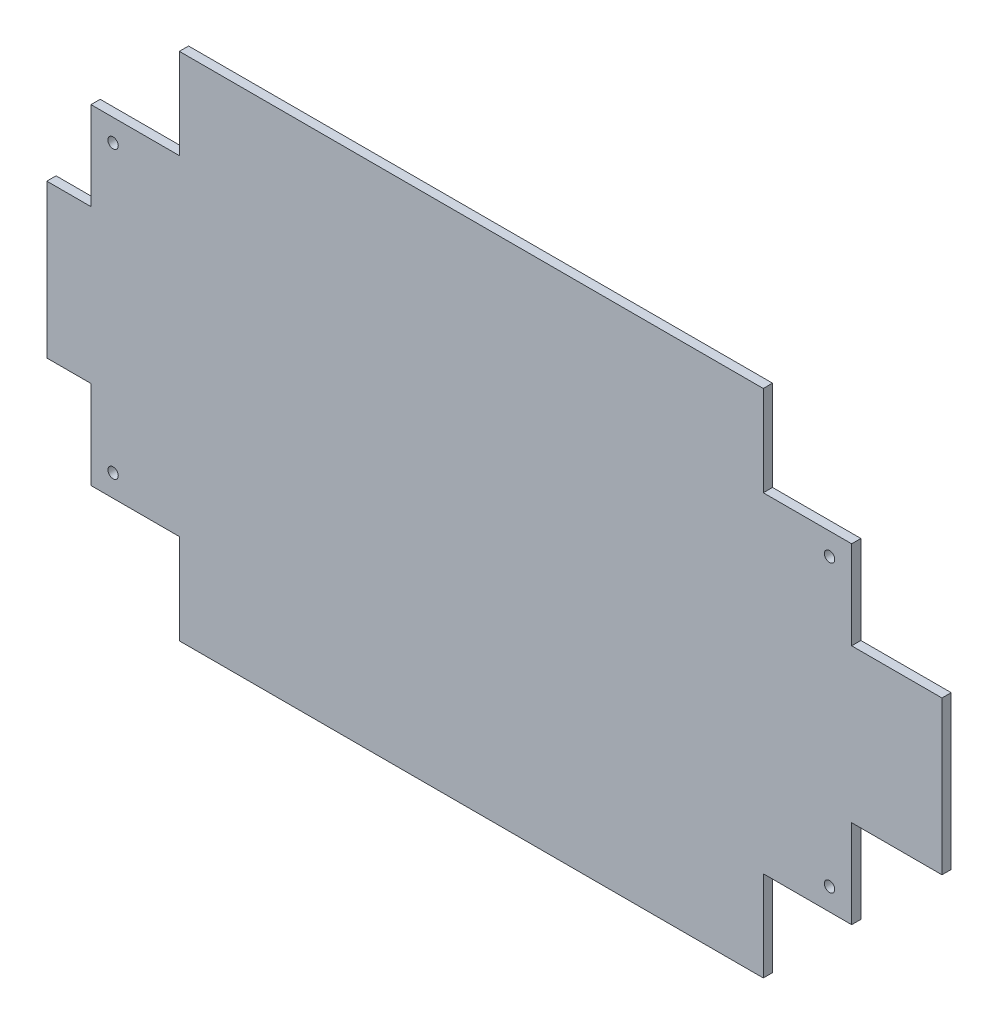
ISO-10303-21;
HEADER;
FILE_DESCRIPTION(('STEP AP214'),'2;1');
FILE_NAME('part.step','',(''),(''),'','','');
FILE_SCHEMA(('AUTOMOTIVE_DESIGN { 1 0 10303 214 1 1 1 1 }'));
ENDSEC;
DATA;
#1=APPLICATION_CONTEXT('core data for automotive mechanical design processes');
#2=APPLICATION_PROTOCOL_DEFINITION('international standard','automotive_design',2000,#1);
#3=PRODUCT_CONTEXT('',#1,'mechanical');
#4=PRODUCT('Part','Part','',(#3));
#5=PRODUCT_RELATED_PRODUCT_CATEGORY('part','',(#4));
#6=PRODUCT_DEFINITION_FORMATION('','',#4);
#7=PRODUCT_DEFINITION_CONTEXT('part definition',#1,'design');
#8=PRODUCT_DEFINITION('design','',#6,#7);
#9=PRODUCT_DEFINITION_SHAPE('','',#8);
#10=(LENGTH_UNIT() NAMED_UNIT(*) SI_UNIT(.MILLI.,.METRE.));
#11=(NAMED_UNIT(*) PLANE_ANGLE_UNIT() SI_UNIT($,.RADIAN.));
#12=(NAMED_UNIT(*) SI_UNIT($,.STERADIAN.) SOLID_ANGLE_UNIT());
#13=UNCERTAINTY_MEASURE_WITH_UNIT(LENGTH_MEASURE(1.E-05),#10,'distance_accuracy_value','');
#14=(GEOMETRIC_REPRESENTATION_CONTEXT(3) GLOBAL_UNCERTAINTY_ASSIGNED_CONTEXT((#13)) GLOBAL_UNIT_ASSIGNED_CONTEXT((#10,
#11,#12)) REPRESENTATION_CONTEXT('',''));
#15=CARTESIAN_POINT('',(0.,0.,0.));
#16=DIRECTION('',(0.,0.,1.));
#17=DIRECTION('',(1.,0.,0.));
#18=AXIS2_PLACEMENT_3D('',#15,#16,#17);
#19=CARTESIAN_POINT('',(0.,0.,0.));
#20=DIRECTION('',(0.,0.,1.));
#21=DIRECTION('',(-1.,0.,0.));
#22=AXIS2_PLACEMENT_3D('',#19,#20,#21);
#23=PLANE('',#22);
#24=CARTESIAN_POINT('',(45.6000000000041,98.3000000000001,0.));
#25=DIRECTION('',(0.,0.,1.));
#26=DIRECTION('',(1.,0.,0.));
#27=AXIS2_PLACEMENT_3D('',#24,#25,#26);
#28=CIRCLE('',#27,3.57123999999999);
#29=CARTESIAN_POINT('',(49.1712400000041,98.3000000000001,0.));
#30=VERTEX_POINT('',#29);
#31=EDGE_CURVE('E379',#30,#30,#28,.T.);
#32=ORIENTED_EDGE('',*,*,#31,.T.);
#33=EDGE_LOOP('',(#32));
#34=FACE_BOUND('',#33,.T.);
#35=CARTESIAN_POINT('',(45.6000000000084,-98.3000000000018,0.));
#36=DIRECTION('',(0.,0.,1.));
#37=DIRECTION('',(1.,0.,0.));
#38=AXIS2_PLACEMENT_3D('',#35,#36,#37);
#39=CIRCLE('',#38,3.57123999999999);
#40=CARTESIAN_POINT('',(49.1712400000084,-98.3000000000018,0.));
#41=VERTEX_POINT('',#40);
#42=EDGE_CURVE('E395',#41,#41,#39,.T.);
#43=ORIENTED_EDGE('',*,*,#42,.T.);
#44=EDGE_LOOP('',(#43));
#45=FACE_BOUND('',#44,.T.);
#46=CARTESIAN_POINT('',(538.600000000004,-98.2999999999997,0.));
#47=DIRECTION('',(0.,0.,1.));
#48=DIRECTION('',(1.,0.,0.));
#49=AXIS2_PLACEMENT_3D('',#46,#47,#48);
#50=CIRCLE('',#49,3.57123999999998);
#51=CARTESIAN_POINT('',(542.171240000004,-98.2999999999997,0.));
#52=VERTEX_POINT('',#51);
#53=EDGE_CURVE('E401',#52,#52,#50,.T.);
#54=ORIENTED_EDGE('',*,*,#53,.T.);
#55=EDGE_LOOP('',(#54));
#56=FACE_BOUND('',#55,.T.);
#57=DIRECTION('',(0.,-1.,0.));
#58=VECTOR('',#57,1.);
#59=CARTESIAN_POINT('',(492.999999999998,113.5,0.));
#60=LINE('',#59,#58);
#61=CARTESIAN_POINT('',(492.999999999998,175.65,0.));
#62=VERTEX_POINT('',#61);
#63=CARTESIAN_POINT('',(492.999999999998,113.5,0.));
#64=VERTEX_POINT('',#63);
#65=EDGE_CURVE('E239',#62,#64,#60,.T.);
#66=ORIENTED_EDGE('',*,*,#65,.T.);
#67=DIRECTION('',(1.,0.,0.));
#68=VECTOR('',#67,1.);
#69=CARTESIAN_POINT('',(553.799999999996,113.5,0.));
#70=LINE('',#69,#68);
#71=CARTESIAN_POINT('',(553.799999999996,113.5,0.));
#72=VERTEX_POINT('',#71);
#73=EDGE_CURVE('E167',#64,#72,#70,.T.);
#74=ORIENTED_EDGE('',*,*,#73,.T.);
#75=DIRECTION('',(0.,-1.,0.));
#76=VECTOR('',#75,1.);
#77=CARTESIAN_POINT('',(553.799999999996,52.7000000000002,0.));
#78=LINE('',#77,#76);
#79=CARTESIAN_POINT('',(553.799999999996,52.7000000000002,0.));
#80=VERTEX_POINT('',#79);
#81=EDGE_CURVE('E242',#72,#80,#78,.T.);
#82=ORIENTED_EDGE('',*,*,#81,.T.);
#83=DIRECTION('',(1.,0.,0.));
#84=VECTOR('',#83,1.);
#85=CARTESIAN_POINT('',(615.949999999996,52.7000000000002,0.));
#86=LINE('',#85,#84);
#87=CARTESIAN_POINT('',(615.949999999996,52.7000000000002,0.));
#88=VERTEX_POINT('',#87);
#89=EDGE_CURVE('E194',#80,#88,#86,.T.);
#90=ORIENTED_EDGE('',*,*,#89,.T.);
#91=DIRECTION('',(0.,-1.,0.));
#92=VECTOR('',#91,1.);
#93=CARTESIAN_POINT('',(615.949999999996,52.7000000000002,0.));
#94=LINE('',#93,#92);
#95=CARTESIAN_POINT('',(615.949999999996,-52.6999999999997,0.));
#96=VERTEX_POINT('',#95);
#97=EDGE_CURVE('E197',#88,#96,#94,.T.);
#98=ORIENTED_EDGE('',*,*,#97,.T.);
#99=DIRECTION('',(-1.,0.,0.));
#100=VECTOR('',#99,1.);
#101=CARTESIAN_POINT('',(615.949999999996,-52.6999999999997,0.));
#102=LINE('',#101,#100);
#103=CARTESIAN_POINT('',(553.799999999996,-52.6999999999998,0.));
#104=VERTEX_POINT('',#103);
#105=EDGE_CURVE('E200',#96,#104,#102,.T.);
#106=ORIENTED_EDGE('',*,*,#105,.T.);
#107=DIRECTION('',(0.,-1.,0.));
#108=VECTOR('',#107,1.);
#109=CARTESIAN_POINT('',(553.799999999996,-52.6999999999998,0.));
#110=LINE('',#109,#108);
#111=CARTESIAN_POINT('',(553.799999999996,-113.5,0.));
#112=VERTEX_POINT('',#111);
#113=EDGE_CURVE('E203',#104,#112,#110,.T.);
#114=ORIENTED_EDGE('',*,*,#113,.T.);
#115=DIRECTION('',(-1.,0.,0.));
#116=VECTOR('',#115,1.);
#117=CARTESIAN_POINT('',(553.799999999996,-113.5,0.));
#118=LINE('',#117,#116);
#119=CARTESIAN_POINT('',(492.999999999998,-113.5,0.));
#120=VERTEX_POINT('',#119);
#121=EDGE_CURVE('E206',#112,#120,#118,.T.);
#122=ORIENTED_EDGE('',*,*,#121,.T.);
#123=DIRECTION('',(0.,-1.,0.));
#124=VECTOR('',#123,1.);
#125=CARTESIAN_POINT('',(492.999999999998,-113.5,0.));
#126=LINE('',#125,#124);
#127=CARTESIAN_POINT('',(492.999999999998,-175.65,0.));
#128=VERTEX_POINT('',#127);
#129=EDGE_CURVE('E209',#120,#128,#126,.T.);
#130=ORIENTED_EDGE('',*,*,#129,.T.);
#131=DIRECTION('',(-1.,0.,0.));
#132=VECTOR('',#131,1.);
#133=CARTESIAN_POINT('',(492.999999999998,-175.65,0.));
#134=LINE('',#133,#132);
#135=CARTESIAN_POINT('',(91.2000000000021,-175.65,0.));
#136=VERTEX_POINT('',#135);
#137=EDGE_CURVE('E385',#128,#136,#134,.T.);
#138=ORIENTED_EDGE('',*,*,#137,.T.);
#139=DIRECTION('',(0.,1.,0.));
#140=VECTOR('',#139,1.);
#141=CARTESIAN_POINT('',(91.2000000000021,-174.3,0.));
#142=LINE('',#141,#140);
#143=CARTESIAN_POINT('',(91.2000000000021,-113.5,0.));
#144=VERTEX_POINT('',#143);
#145=EDGE_CURVE('E212',#136,#144,#142,.T.);
#146=ORIENTED_EDGE('',*,*,#145,.T.);
#147=DIRECTION('',(-1.,0.,0.));
#148=VECTOR('',#147,1.);
#149=CARTESIAN_POINT('',(91.2000000000021,-113.5,0.));
#150=LINE('',#149,#148);
#151=CARTESIAN_POINT('',(30.4000000000042,-113.5,0.));
#152=VERTEX_POINT('',#151);
#153=EDGE_CURVE('E215',#144,#152,#150,.T.);
#154=ORIENTED_EDGE('',*,*,#153,.T.);
#155=DIRECTION('',(0.,1.,0.));
#156=VECTOR('',#155,1.);
#157=CARTESIAN_POINT('',(30.4000000000042,-113.5,0.));
#158=LINE('',#157,#156);
#159=CARTESIAN_POINT('',(30.4000000000042,-52.6999999999999,0.));
#160=VERTEX_POINT('',#159);
#161=EDGE_CURVE('E218',#152,#160,#158,.T.);
#162=ORIENTED_EDGE('',*,*,#161,.T.);
#163=DIRECTION('',(-1.,0.,0.));
#164=VECTOR('',#163,1.);
#165=CARTESIAN_POINT('',(30.4000000000042,-52.6999999999999,0.));
#166=LINE('',#165,#164);
#167=CARTESIAN_POINT('',(0.,-52.6999999999999,0.));
#168=VERTEX_POINT('',#167);
#169=EDGE_CURVE('E221',#160,#168,#166,.T.);
#170=ORIENTED_EDGE('',*,*,#169,.T.);
#171=DIRECTION('',(0.,1.,0.));
#172=VECTOR('',#171,1.);
#173=CARTESIAN_POINT('',(0.,-52.6999999999999,0.));
#174=LINE('',#173,#172);
#175=CARTESIAN_POINT('',(0.,52.6999999999999,0.));
#176=VERTEX_POINT('',#175);
#177=EDGE_CURVE('E224',#168,#176,#174,.T.);
#178=ORIENTED_EDGE('',*,*,#177,.T.);
#179=DIRECTION('',(1.,0.,0.));
#180=VECTOR('',#179,1.);
#181=CARTESIAN_POINT('',(0.,52.6999999999999,0.));
#182=LINE('',#181,#180);
#183=CARTESIAN_POINT('',(30.4000000000042,52.6999999999999,0.));
#184=VERTEX_POINT('',#183);
#185=EDGE_CURVE('E227',#176,#184,#182,.T.);
#186=ORIENTED_EDGE('',*,*,#185,.T.);
#187=DIRECTION('',(0.,1.,0.));
#188=VECTOR('',#187,1.);
#189=CARTESIAN_POINT('',(30.4000000000042,52.6999999999999,0.));
#190=LINE('',#189,#188);
#191=CARTESIAN_POINT('',(30.4000000000041,113.5,0.));
#192=VERTEX_POINT('',#191);
#193=EDGE_CURVE('E230',#184,#192,#190,.T.);
#194=ORIENTED_EDGE('',*,*,#193,.T.);
#195=DIRECTION('',(1.,0.,0.));
#196=VECTOR('',#195,1.);
#197=CARTESIAN_POINT('',(30.4000000000041,113.5,0.));
#198=LINE('',#197,#196);
#199=CARTESIAN_POINT('',(91.2000000000021,113.5,0.));
#200=VERTEX_POINT('',#199);
#201=EDGE_CURVE('E233',#192,#200,#198,.T.);
#202=ORIENTED_EDGE('',*,*,#201,.T.);
#203=DIRECTION('',(0.,1.,0.));
#204=VECTOR('',#203,1.);
#205=CARTESIAN_POINT('',(91.2000000000021,113.5,0.));
#206=LINE('',#205,#204);
#207=CARTESIAN_POINT('',(91.2000000000021,175.65,0.));
#208=VERTEX_POINT('',#207);
#209=EDGE_CURVE('E236',#200,#208,#206,.T.);
#210=ORIENTED_EDGE('',*,*,#209,.T.);
#211=DIRECTION('',(-1.,0.,0.));
#212=VECTOR('',#211,1.);
#213=CARTESIAN_POINT('',(492.999999999998,175.65,0.));
#214=LINE('',#213,#212);
#215=EDGE_CURVE('E323',#62,#208,#214,.T.);
#216=ORIENTED_EDGE('',*,*,#215,.F.);
#217=EDGE_LOOP('',(#66,#74,#82,#90,#98,#106,#114,#122,#130,#138,#146,#154,#162,#170,#178,#186,
#194,#202,#210,#216));
#218=FACE_BOUND('',#217,.T.);
#219=CARTESIAN_POINT('',(538.600000000004,98.3000000000004,0.));
#220=DIRECTION('',(0.,0.,1.));
#221=DIRECTION('',(1.,0.,0.));
#222=AXIS2_PLACEMENT_3D('',#219,#220,#221);
#223=CIRCLE('',#222,3.57123999999998);
#224=CARTESIAN_POINT('',(542.171240000004,98.3000000000004,0.));
#225=VERTEX_POINT('',#224);
#226=EDGE_CURVE('E328',#225,#225,#223,.T.);
#227=ORIENTED_EDGE('',*,*,#226,.T.);
#228=EDGE_LOOP('',(#227));
#229=FACE_BOUND('',#228,.T.);
#230=ADVANCED_FACE('F33',(#34,#45,#56,#218,#229),#23,.F.);
#231=CARTESIAN_POINT('',(0.,0.,6.35));
#232=DIRECTION('',(0.,0.,1.));
#233=DIRECTION('',(-1.,0.,0.));
#234=AXIS2_PLACEMENT_3D('',#231,#232,#233);
#235=PLANE('',#234);
#236=CARTESIAN_POINT('',(45.6000000000041,98.3000000000001,6.35));
#237=DIRECTION('',(0.,0.,1.));
#238=DIRECTION('',(1.,0.,0.));
#239=AXIS2_PLACEMENT_3D('',#236,#237,#238);
#240=CIRCLE('',#239,3.57124);
#241=CARTESIAN_POINT('',(49.1712400000041,98.3000000000001,6.35));
#242=VERTEX_POINT('',#241);
#243=EDGE_CURVE('E392',#242,#242,#240,.T.);
#244=ORIENTED_EDGE('',*,*,#243,.F.);
#245=EDGE_LOOP('',(#244));
#246=FACE_BOUND('',#245,.T.);
#247=CARTESIAN_POINT('',(45.6000000000084,-98.3000000000018,6.35));
#248=DIRECTION('',(0.,0.,1.));
#249=DIRECTION('',(1.,0.,0.));
#250=AXIS2_PLACEMENT_3D('',#247,#248,#249);
#251=CIRCLE('',#250,3.57124);
#252=CARTESIAN_POINT('',(49.1712400000084,-98.3000000000018,6.35));
#253=VERTEX_POINT('',#252);
#254=EDGE_CURVE('E398',#253,#253,#251,.T.);
#255=ORIENTED_EDGE('',*,*,#254,.F.);
#256=EDGE_LOOP('',(#255));
#257=FACE_BOUND('',#256,.T.);
#258=CARTESIAN_POINT('',(538.600000000004,-98.2999999999997,6.35));
#259=DIRECTION('',(0.,0.,1.));
#260=DIRECTION('',(1.,0.,0.));
#261=AXIS2_PLACEMENT_3D('',#258,#259,#260);
#262=CIRCLE('',#261,3.57123999999998);
#263=CARTESIAN_POINT('',(542.171240000004,-98.2999999999997,6.35));
#264=VERTEX_POINT('',#263);
#265=EDGE_CURVE('E404',#264,#264,#262,.T.);
#266=ORIENTED_EDGE('',*,*,#265,.F.);
#267=EDGE_LOOP('',(#266));
#268=FACE_BOUND('',#267,.T.);
#269=DIRECTION('',(-1.,0.,0.));
#270=VECTOR('',#269,1.);
#271=CARTESIAN_POINT('',(492.999999999998,175.65,6.35));
#272=LINE('',#271,#270);
#273=CARTESIAN_POINT('',(492.999999999998,175.65,6.35));
#274=VERTEX_POINT('',#273);
#275=CARTESIAN_POINT('',(91.200000000002,175.65,6.35));
#276=VERTEX_POINT('',#275);
#277=EDGE_CURVE('E321',#274,#276,#272,.T.);
#278=ORIENTED_EDGE('',*,*,#277,.T.);
#279=DIRECTION('',(0.,1.,0.));
#280=VECTOR('',#279,1.);
#281=CARTESIAN_POINT('',(91.2000000000021,113.5,6.35));
#282=LINE('',#281,#280);
#283=CARTESIAN_POINT('',(91.2000000000021,113.5,6.35));
#284=VERTEX_POINT('',#283);
#285=EDGE_CURVE('E184',#284,#276,#282,.T.);
#286=ORIENTED_EDGE('',*,*,#285,.F.);
#287=DIRECTION('',(1.,0.,0.));
#288=VECTOR('',#287,1.);
#289=CARTESIAN_POINT('',(30.4000000000041,113.5,6.35));
#290=LINE('',#289,#288);
#291=CARTESIAN_POINT('',(30.4000000000041,113.5,6.35));
#292=VERTEX_POINT('',#291);
#293=EDGE_CURVE('E316',#292,#284,#290,.T.);
#294=ORIENTED_EDGE('',*,*,#293,.F.);
#295=DIRECTION('',(0.,1.,0.));
#296=VECTOR('',#295,1.);
#297=CARTESIAN_POINT('',(30.4000000000042,52.6999999999999,6.35));
#298=LINE('',#297,#296);
#299=CARTESIAN_POINT('',(30.4000000000042,52.6999999999999,6.35));
#300=VERTEX_POINT('',#299);
#301=EDGE_CURVE('E313',#300,#292,#298,.T.);
#302=ORIENTED_EDGE('',*,*,#301,.F.);
#303=DIRECTION('',(1.,0.,0.));
#304=VECTOR('',#303,1.);
#305=CARTESIAN_POINT('',(0.,52.6999999999999,6.35));
#306=LINE('',#305,#304);
#307=CARTESIAN_POINT('',(0.,52.6999999999999,6.35));
#308=VERTEX_POINT('',#307);
#309=EDGE_CURVE('E310',#308,#300,#306,.T.);
#310=ORIENTED_EDGE('',*,*,#309,.F.);
#311=DIRECTION('',(0.,1.,0.));
#312=VECTOR('',#311,1.);
#313=CARTESIAN_POINT('',(0.,-52.6999999999999,6.35));
#314=LINE('',#313,#312);
#315=CARTESIAN_POINT('',(0.,-52.6999999999999,6.35));
#316=VERTEX_POINT('',#315);
#317=EDGE_CURVE('E307',#316,#308,#314,.T.);
#318=ORIENTED_EDGE('',*,*,#317,.F.);
#319=DIRECTION('',(-1.,0.,0.));
#320=VECTOR('',#319,1.);
#321=CARTESIAN_POINT('',(30.4000000000042,-52.6999999999999,6.35));
#322=LINE('',#321,#320);
#323=CARTESIAN_POINT('',(30.4000000000042,-52.6999999999999,6.35));
#324=VERTEX_POINT('',#323);
#325=EDGE_CURVE('E304',#324,#316,#322,.T.);
#326=ORIENTED_EDGE('',*,*,#325,.F.);
#327=DIRECTION('',(0.,1.,0.));
#328=VECTOR('',#327,1.);
#329=CARTESIAN_POINT('',(30.4000000000042,-113.5,6.35));
#330=LINE('',#329,#328);
#331=CARTESIAN_POINT('',(30.4000000000042,-113.5,6.35));
#332=VERTEX_POINT('',#331);
#333=EDGE_CURVE('E301',#332,#324,#330,.T.);
#334=ORIENTED_EDGE('',*,*,#333,.F.);
#335=DIRECTION('',(-1.,0.,0.));
#336=VECTOR('',#335,1.);
#337=CARTESIAN_POINT('',(91.2000000000021,-113.5,6.35));
#338=LINE('',#337,#336);
#339=CARTESIAN_POINT('',(91.2000000000021,-113.5,6.35));
#340=VERTEX_POINT('',#339);
#341=EDGE_CURVE('E298',#340,#332,#338,.T.);
#342=ORIENTED_EDGE('',*,*,#341,.F.);
#343=DIRECTION('',(0.,1.,0.));
#344=VECTOR('',#343,1.);
#345=CARTESIAN_POINT('',(91.2000000000021,-174.3,6.35));
#346=LINE('',#345,#344);
#347=CARTESIAN_POINT('',(91.2000000000021,-175.65,6.35));
#348=VERTEX_POINT('',#347);
#349=EDGE_CURVE('E295',#348,#340,#346,.T.);
#350=ORIENTED_EDGE('',*,*,#349,.F.);
#351=DIRECTION('',(-1.,0.,0.));
#352=VECTOR('',#351,1.);
#353=CARTESIAN_POINT('',(492.999999999998,-175.65,6.35));
#354=LINE('',#353,#352);
#355=CARTESIAN_POINT('',(492.999999999998,-175.65,6.35));
#356=VERTEX_POINT('',#355);
#357=EDGE_CURVE('E366',#356,#348,#354,.T.);
#358=ORIENTED_EDGE('',*,*,#357,.F.);
#359=DIRECTION('',(0.,-1.,0.));
#360=VECTOR('',#359,1.);
#361=CARTESIAN_POINT('',(492.999999999998,-113.5,6.35));
#362=LINE('',#361,#360);
#363=CARTESIAN_POINT('',(492.999999999998,-113.5,6.35));
#364=VERTEX_POINT('',#363);
#365=EDGE_CURVE('E292',#364,#356,#362,.T.);
#366=ORIENTED_EDGE('',*,*,#365,.F.);
#367=DIRECTION('',(-1.,0.,0.));
#368=VECTOR('',#367,1.);
#369=CARTESIAN_POINT('',(553.799999999996,-113.5,6.35));
#370=LINE('',#369,#368);
#371=CARTESIAN_POINT('',(553.799999999996,-113.5,6.35));
#372=VERTEX_POINT('',#371);
#373=EDGE_CURVE('E289',#372,#364,#370,.T.);
#374=ORIENTED_EDGE('',*,*,#373,.F.);
#375=DIRECTION('',(0.,-1.,0.));
#376=VECTOR('',#375,1.);
#377=CARTESIAN_POINT('',(553.799999999996,-52.6999999999998,6.35));
#378=LINE('',#377,#376);
#379=CARTESIAN_POINT('',(553.799999999996,-52.6999999999998,6.35));
#380=VERTEX_POINT('',#379);
#381=EDGE_CURVE('E283',#380,#372,#378,.T.);
#382=ORIENTED_EDGE('',*,*,#381,.F.);
#383=DIRECTION('',(-1.,0.,0.));
#384=VECTOR('',#383,1.);
#385=CARTESIAN_POINT('',(615.949999999996,-52.6999999999997,6.35));
#386=LINE('',#385,#384);
#387=CARTESIAN_POINT('',(615.949999999996,-52.6999999999997,6.35));
#388=VERTEX_POINT('',#387);
#389=EDGE_CURVE('E281',#388,#380,#386,.T.);
#390=ORIENTED_EDGE('',*,*,#389,.F.);
#391=DIRECTION('',(0.,-1.,0.));
#392=VECTOR('',#391,1.);
#393=CARTESIAN_POINT('',(615.949999999996,52.7000000000002,6.35));
#394=LINE('',#393,#392);
#395=CARTESIAN_POINT('',(615.949999999996,52.7000000000002,6.35));
#396=VERTEX_POINT('',#395);
#397=EDGE_CURVE('E271',#396,#388,#394,.T.);
#398=ORIENTED_EDGE('',*,*,#397,.F.);
#399=DIRECTION('',(1.,0.,0.));
#400=VECTOR('',#399,1.);
#401=CARTESIAN_POINT('',(615.949999999996,52.7000000000002,6.35));
#402=LINE('',#401,#400);
#403=CARTESIAN_POINT('',(553.799999999996,52.7000000000002,6.35));
#404=VERTEX_POINT('',#403);
#405=EDGE_CURVE('E245',#404,#396,#402,.T.);
#406=ORIENTED_EDGE('',*,*,#405,.F.);
#407=DIRECTION('',(0.,-1.,0.));
#408=VECTOR('',#407,1.);
#409=CARTESIAN_POINT('',(553.799999999996,52.7000000000002,6.35));
#410=LINE('',#409,#408);
#411=CARTESIAN_POINT('',(553.799999999996,113.5,6.35));
#412=VERTEX_POINT('',#411);
#413=EDGE_CURVE('E189',#412,#404,#410,.T.);
#414=ORIENTED_EDGE('',*,*,#413,.F.);
#415=DIRECTION('',(1.,0.,0.));
#416=VECTOR('',#415,1.);
#417=CARTESIAN_POINT('',(553.799999999996,113.5,6.35));
#418=LINE('',#417,#416);
#419=CARTESIAN_POINT('',(492.999999999998,113.5,6.35));
#420=VERTEX_POINT('',#419);
#421=EDGE_CURVE('E164',#420,#412,#418,.T.);
#422=ORIENTED_EDGE('',*,*,#421,.F.);
#423=DIRECTION('',(0.,-1.,0.));
#424=VECTOR('',#423,1.);
#425=CARTESIAN_POINT('',(492.999999999998,113.5,6.35));
#426=LINE('',#425,#424);
#427=EDGE_CURVE('E176',#274,#420,#426,.T.);
#428=ORIENTED_EDGE('',*,*,#427,.F.);
#429=EDGE_LOOP('',(#278,#286,#294,#302,#310,#318,#326,#334,#342,#350,#358,#366,#374,#382,#390,
#398,#406,#414,#422,#428));
#430=FACE_BOUND('',#429,.T.);
#431=CARTESIAN_POINT('',(538.600000000004,98.3000000000004,6.35));
#432=DIRECTION('',(0.,0.,1.));
#433=DIRECTION('',(1.,0.,0.));
#434=AXIS2_PLACEMENT_3D('',#431,#432,#433);
#435=CIRCLE('',#434,3.57123999999998);
#436=CARTESIAN_POINT('',(542.171240000004,98.3000000000004,6.35));
#437=VERTEX_POINT('',#436);
#438=EDGE_CURVE('E324',#437,#437,#435,.T.);
#439=ORIENTED_EDGE('',*,*,#438,.F.);
#440=EDGE_LOOP('',(#439));
#441=FACE_BOUND('',#440,.T.);
#442=ADVANCED_FACE('F186',(#246,#257,#268,#430,#441),#235,.T.);
#443=CARTESIAN_POINT('',(615.949999999996,52.7000000000002,6.35));
#444=DIRECTION('',(0.,-1.,0.));
#445=DIRECTION('',(-1.,0.,0.));
#446=AXIS2_PLACEMENT_3D('',#443,#444,#445);
#447=PLANE('',#446);
#448=ORIENTED_EDGE('',*,*,#89,.F.);
#449=DIRECTION('',(0.,0.,-1.));
#450=VECTOR('',#449,1.);
#451=CARTESIAN_POINT('',(553.799999999996,52.7000000000002,6.35));
#452=LINE('',#451,#450);
#453=EDGE_CURVE('E57',#404,#80,#452,.T.);
#454=ORIENTED_EDGE('',*,*,#453,.F.);
#455=ORIENTED_EDGE('',*,*,#405,.T.);
#456=DIRECTION('',(0.,0.,-1.));
#457=VECTOR('',#456,1.);
#458=CARTESIAN_POINT('',(615.949999999996,52.7000000000002,6.35));
#459=LINE('',#458,#457);
#460=EDGE_CURVE('E11',#396,#88,#459,.T.);
#461=ORIENTED_EDGE('',*,*,#460,.T.);
#462=EDGE_LOOP('',(#448,#454,#455,#461));
#463=FACE_BOUND('',#462,.T.);
#464=ADVANCED_FACE('F35',(#463),#447,.F.);
#465=CARTESIAN_POINT('',(615.949999999996,52.7000000000002,6.35));
#466=DIRECTION('',(-1.,0.,0.));
#467=DIRECTION('',(0.,0.,-1.));
#468=AXIS2_PLACEMENT_3D('',#465,#466,#467);
#469=PLANE('',#468);
#470=ORIENTED_EDGE('',*,*,#97,.F.);
#471=ORIENTED_EDGE('',*,*,#460,.F.);
#472=ORIENTED_EDGE('',*,*,#397,.T.);
#473=DIRECTION('',(0.,0.,-1.));
#474=VECTOR('',#473,1.);
#475=CARTESIAN_POINT('',(615.949999999996,-52.6999999999997,6.35));
#476=LINE('',#475,#474);
#477=EDGE_CURVE('E41',#388,#96,#476,.T.);
#478=ORIENTED_EDGE('',*,*,#477,.T.);
#479=EDGE_LOOP('',(#470,#471,#472,#478));
#480=FACE_BOUND('',#479,.T.);
#481=ADVANCED_FACE('F269',(#480),#469,.F.);
#482=CARTESIAN_POINT('',(615.949999999996,-52.6999999999997,6.35));
#483=DIRECTION('',(0.,1.,0.));
#484=DIRECTION('',(0.,0.,1.));
#485=AXIS2_PLACEMENT_3D('',#482,#483,#484);
#486=PLANE('',#485);
#487=ORIENTED_EDGE('',*,*,#105,.F.);
#488=ORIENTED_EDGE('',*,*,#477,.F.);
#489=ORIENTED_EDGE('',*,*,#389,.T.);
#490=DIRECTION('',(0.,0.,-1.));
#491=VECTOR('',#490,1.);
#492=CARTESIAN_POINT('',(553.799999999996,-52.6999999999998,6.35));
#493=LINE('',#492,#491);
#494=EDGE_CURVE('E267',#380,#104,#493,.T.);
#495=ORIENTED_EDGE('',*,*,#494,.T.);
#496=EDGE_LOOP('',(#487,#488,#489,#495));
#497=FACE_BOUND('',#496,.T.);
#498=ADVANCED_FACE('F275',(#497),#486,.F.);
#499=CARTESIAN_POINT('',(553.799999999996,-52.6999999999998,6.35));
#500=DIRECTION('',(-1.,0.,0.));
#501=DIRECTION('',(0.,0.,-1.));
#502=AXIS2_PLACEMENT_3D('',#499,#500,#501);
#503=PLANE('',#502);
#504=ORIENTED_EDGE('',*,*,#113,.F.);
#505=ORIENTED_EDGE('',*,*,#494,.F.);
#506=ORIENTED_EDGE('',*,*,#381,.T.);
#507=DIRECTION('',(0.,0.,-1.));
#508=VECTOR('',#507,1.);
#509=CARTESIAN_POINT('',(553.799999999996,-113.5,6.35));
#510=LINE('',#509,#508);
#511=EDGE_CURVE('E265',#372,#112,#510,.T.);
#512=ORIENTED_EDGE('',*,*,#511,.T.);
#513=EDGE_LOOP('',(#504,#505,#506,#512));
#514=FACE_BOUND('',#513,.T.);
#515=ADVANCED_FACE('F465',(#514),#503,.F.);
#516=CARTESIAN_POINT('',(553.799999999996,-113.5,6.35));
#517=DIRECTION('',(0.,1.,0.));
#518=DIRECTION('',(1.,0.,0.));
#519=AXIS2_PLACEMENT_3D('',#516,#517,#518);
#520=PLANE('',#519);
#521=ORIENTED_EDGE('',*,*,#121,.F.);
#522=ORIENTED_EDGE('',*,*,#511,.F.);
#523=ORIENTED_EDGE('',*,*,#373,.T.);
#524=DIRECTION('',(0.,0.,-1.));
#525=VECTOR('',#524,1.);
#526=CARTESIAN_POINT('',(492.999999999998,-113.5,6.35));
#527=LINE('',#526,#525);
#528=EDGE_CURVE('E263',#364,#120,#527,.T.);
#529=ORIENTED_EDGE('',*,*,#528,.T.);
#530=EDGE_LOOP('',(#521,#522,#523,#529));
#531=FACE_BOUND('',#530,.T.);
#532=ADVANCED_FACE('F461',(#531),#520,.F.);
#533=CARTESIAN_POINT('',(492.999999999998,-113.5,6.35));
#534=DIRECTION('',(-1.,0.,0.));
#535=DIRECTION('',(0.,1.,0.));
#536=AXIS2_PLACEMENT_3D('',#533,#534,#535);
#537=PLANE('',#536);
#538=ORIENTED_EDGE('',*,*,#129,.F.);
#539=ORIENTED_EDGE('',*,*,#528,.F.);
#540=ORIENTED_EDGE('',*,*,#365,.T.);
#541=DIRECTION('',(0.,0.,1.));
#542=VECTOR('',#541,1.);
#543=CARTESIAN_POINT('',(492.999999999998,-175.65,0.));
#544=LINE('',#543,#542);
#545=EDGE_CURVE('E380',#128,#356,#544,.T.);
#546=ORIENTED_EDGE('',*,*,#545,.F.);
#547=EDGE_LOOP('',(#538,#539,#540,#546));
#548=FACE_BOUND('',#547,.T.);
#549=ADVANCED_FACE('F458',(#548),#537,.F.);
#550=CARTESIAN_POINT('',(91.2000000000021,-174.3,6.35));
#551=DIRECTION('',(1.,0.,0.));
#552=DIRECTION('',(0.,0.,1.));
#553=AXIS2_PLACEMENT_3D('',#550,#551,#552);
#554=PLANE('',#553);
#555=ORIENTED_EDGE('',*,*,#145,.F.);
#556=DIRECTION('',(0.,0.,1.));
#557=VECTOR('',#556,1.);
#558=CARTESIAN_POINT('',(91.2000000000021,-175.65,0.));
#559=LINE('',#558,#557);
#560=EDGE_CURVE('E374',#136,#348,#559,.T.);
#561=ORIENTED_EDGE('',*,*,#560,.T.);
#562=ORIENTED_EDGE('',*,*,#349,.T.);
#563=DIRECTION('',(0.,0.,-1.));
#564=VECTOR('',#563,1.);
#565=CARTESIAN_POINT('',(91.2000000000021,-113.5,6.35));
#566=LINE('',#565,#564);
#567=EDGE_CURVE('E261',#340,#144,#566,.T.);
#568=ORIENTED_EDGE('',*,*,#567,.T.);
#569=EDGE_LOOP('',(#555,#561,#562,#568));
#570=FACE_BOUND('',#569,.T.);
#571=ADVANCED_FACE('F372',(#570),#554,.F.);
#572=CARTESIAN_POINT('',(91.2000000000021,-113.5,6.35));
#573=DIRECTION('',(0.,1.,0.));
#574=DIRECTION('',(1.,0.,0.));
#575=AXIS2_PLACEMENT_3D('',#572,#573,#574);
#576=PLANE('',#575);
#577=ORIENTED_EDGE('',*,*,#153,.F.);
#578=ORIENTED_EDGE('',*,*,#567,.F.);
#579=ORIENTED_EDGE('',*,*,#341,.T.);
#580=DIRECTION('',(0.,0.,-1.));
#581=VECTOR('',#580,1.);
#582=CARTESIAN_POINT('',(30.4000000000042,-113.5,6.35));
#583=LINE('',#582,#581);
#584=EDGE_CURVE('E259',#332,#152,#583,.T.);
#585=ORIENTED_EDGE('',*,*,#584,.T.);
#586=EDGE_LOOP('',(#577,#578,#579,#585));
#587=FACE_BOUND('',#586,.T.);
#588=ADVANCED_FACE('F359',(#587),#576,.F.);
#589=CARTESIAN_POINT('',(30.4000000000042,-113.5,6.35));
#590=DIRECTION('',(1.,0.,0.));
#591=DIRECTION('',(0.,0.,1.));
#592=AXIS2_PLACEMENT_3D('',#589,#590,#591);
#593=PLANE('',#592);
#594=ORIENTED_EDGE('',*,*,#161,.F.);
#595=ORIENTED_EDGE('',*,*,#584,.F.);
#596=ORIENTED_EDGE('',*,*,#333,.T.);
#597=DIRECTION('',(0.,0.,-1.));
#598=VECTOR('',#597,1.);
#599=CARTESIAN_POINT('',(30.4000000000042,-52.6999999999999,6.35));
#600=LINE('',#599,#598);
#601=EDGE_CURVE('E257',#324,#160,#600,.T.);
#602=ORIENTED_EDGE('',*,*,#601,.T.);
#603=EDGE_LOOP('',(#594,#595,#596,#602));
#604=FACE_BOUND('',#603,.T.);
#605=ADVANCED_FACE('F356',(#604),#593,.F.);
#606=CARTESIAN_POINT('',(30.4000000000042,-52.6999999999999,6.35));
#607=DIRECTION('',(0.,1.,0.));
#608=DIRECTION('',(1.,0.,0.));
#609=AXIS2_PLACEMENT_3D('',#606,#607,#608);
#610=PLANE('',#609);
#611=ORIENTED_EDGE('',*,*,#169,.F.);
#612=ORIENTED_EDGE('',*,*,#601,.F.);
#613=ORIENTED_EDGE('',*,*,#325,.T.);
#614=DIRECTION('',(0.,0.,-1.));
#615=VECTOR('',#614,1.);
#616=CARTESIAN_POINT('',(0.,-52.6999999999999,6.35));
#617=LINE('',#616,#615);
#618=EDGE_CURVE('E255',#316,#168,#617,.T.);
#619=ORIENTED_EDGE('',*,*,#618,.T.);
#620=EDGE_LOOP('',(#611,#612,#613,#619));
#621=FACE_BOUND('',#620,.T.);
#622=ADVANCED_FACE('F353',(#621),#610,.F.);
#623=CARTESIAN_POINT('',(0.,-52.6999999999999,6.35));
#624=DIRECTION('',(1.,0.,0.));
#625=DIRECTION('',(0.,-1.,0.));
#626=AXIS2_PLACEMENT_3D('',#623,#624,#625);
#627=PLANE('',#626);
#628=ORIENTED_EDGE('',*,*,#177,.F.);
#629=ORIENTED_EDGE('',*,*,#618,.F.);
#630=ORIENTED_EDGE('',*,*,#317,.T.);
#631=DIRECTION('',(0.,0.,-1.));
#632=VECTOR('',#631,1.);
#633=CARTESIAN_POINT('',(0.,52.6999999999999,6.35));
#634=LINE('',#633,#632);
#635=EDGE_CURVE('E253',#308,#176,#634,.T.);
#636=ORIENTED_EDGE('',*,*,#635,.T.);
#637=EDGE_LOOP('',(#628,#629,#630,#636));
#638=FACE_BOUND('',#637,.T.);
#639=ADVANCED_FACE('F347',(#638),#627,.F.);
#640=CARTESIAN_POINT('',(0.,52.6999999999999,6.35));
#641=DIRECTION('',(0.,-1.,0.));
#642=DIRECTION('',(0.,0.,-1.));
#643=AXIS2_PLACEMENT_3D('',#640,#641,#642);
#644=PLANE('',#643);
#645=ORIENTED_EDGE('',*,*,#185,.F.);
#646=ORIENTED_EDGE('',*,*,#635,.F.);
#647=ORIENTED_EDGE('',*,*,#309,.T.);
#648=DIRECTION('',(0.,0.,-1.));
#649=VECTOR('',#648,1.);
#650=CARTESIAN_POINT('',(30.4000000000042,52.6999999999999,6.35));
#651=LINE('',#650,#649);
#652=EDGE_CURVE('E251',#300,#184,#651,.T.);
#653=ORIENTED_EDGE('',*,*,#652,.T.);
#654=EDGE_LOOP('',(#645,#646,#647,#653));
#655=FACE_BOUND('',#654,.T.);
#656=ADVANCED_FACE('F344',(#655),#644,.F.);
#657=CARTESIAN_POINT('',(30.4000000000042,52.6999999999999,6.35));
#658=DIRECTION('',(1.,0.,0.));
#659=DIRECTION('',(0.,-1.,0.));
#660=AXIS2_PLACEMENT_3D('',#657,#658,#659);
#661=PLANE('',#660);
#662=ORIENTED_EDGE('',*,*,#193,.F.);
#663=ORIENTED_EDGE('',*,*,#652,.F.);
#664=ORIENTED_EDGE('',*,*,#301,.T.);
#665=DIRECTION('',(0.,0.,-1.));
#666=VECTOR('',#665,1.);
#667=CARTESIAN_POINT('',(30.4000000000041,113.5,6.35));
#668=LINE('',#667,#666);
#669=EDGE_CURVE('E249',#292,#192,#668,.T.);
#670=ORIENTED_EDGE('',*,*,#669,.T.);
#671=EDGE_LOOP('',(#662,#663,#664,#670));
#672=FACE_BOUND('',#671,.T.);
#673=ADVANCED_FACE('F341',(#672),#661,.F.);
#674=CARTESIAN_POINT('',(30.4000000000041,113.5,6.35));
#675=DIRECTION('',(0.,-1.,0.));
#676=DIRECTION('',(-1.,0.,0.));
#677=AXIS2_PLACEMENT_3D('',#674,#675,#676);
#678=PLANE('',#677);
#679=ORIENTED_EDGE('',*,*,#201,.F.);
#680=ORIENTED_EDGE('',*,*,#669,.F.);
#681=ORIENTED_EDGE('',*,*,#293,.T.);
#682=DIRECTION('',(0.,0.,-1.));
#683=VECTOR('',#682,1.);
#684=CARTESIAN_POINT('',(91.2000000000021,113.5,6.35));
#685=LINE('',#684,#683);
#686=EDGE_CURVE('E171',#284,#200,#685,.T.);
#687=ORIENTED_EDGE('',*,*,#686,.T.);
#688=EDGE_LOOP('',(#679,#680,#681,#687));
#689=FACE_BOUND('',#688,.T.);
#690=ADVANCED_FACE('F336',(#689),#678,.F.);
#691=CARTESIAN_POINT('',(91.2000000000021,113.5,6.35));
#692=DIRECTION('',(1.,0.,0.));
#693=DIRECTION('',(0.,-1.,0.));
#694=AXIS2_PLACEMENT_3D('',#691,#692,#693);
#695=PLANE('',#694);
#696=ORIENTED_EDGE('',*,*,#209,.F.);
#697=ORIENTED_EDGE('',*,*,#686,.F.);
#698=ORIENTED_EDGE('',*,*,#285,.T.);
#699=DIRECTION('',(0.,0.,1.));
#700=VECTOR('',#699,1.);
#701=CARTESIAN_POINT('',(91.200000000002,175.65,0.));
#702=LINE('',#701,#700);
#703=EDGE_CURVE('E48',#208,#276,#702,.T.);
#704=ORIENTED_EDGE('',*,*,#703,.F.);
#705=EDGE_LOOP('',(#696,#697,#698,#704));
#706=FACE_BOUND('',#705,.T.);
#707=ADVANCED_FACE('F319',(#706),#695,.F.);
#708=CARTESIAN_POINT('',(492.999999999998,113.5,6.35));
#709=DIRECTION('',(-1.,0.,0.));
#710=DIRECTION('',(0.,0.,-1.));
#711=AXIS2_PLACEMENT_3D('',#708,#709,#710);
#712=PLANE('',#711);
#713=ORIENTED_EDGE('',*,*,#427,.T.);
#714=DIRECTION('',(0.,0.,-1.));
#715=VECTOR('',#714,1.);
#716=CARTESIAN_POINT('',(492.999999999998,113.5,6.35));
#717=LINE('',#716,#715);
#718=EDGE_CURVE('E160',#420,#64,#717,.T.);
#719=ORIENTED_EDGE('',*,*,#718,.T.);
#720=ORIENTED_EDGE('',*,*,#65,.F.);
#721=DIRECTION('',(0.,0.,1.));
#722=VECTOR('',#721,1.);
#723=CARTESIAN_POINT('',(492.999999999998,175.65,0.));
#724=LINE('',#723,#722);
#725=EDGE_CURVE('E180',#62,#274,#724,.T.);
#726=ORIENTED_EDGE('',*,*,#725,.T.);
#727=EDGE_LOOP('',(#713,#719,#720,#726));
#728=FACE_BOUND('',#727,.T.);
#729=ADVANCED_FACE('F177',(#728),#712,.F.);
#730=CARTESIAN_POINT('',(553.799999999996,113.5,6.35));
#731=DIRECTION('',(0.,-1.,0.));
#732=DIRECTION('',(-1.,0.,0.));
#733=AXIS2_PLACEMENT_3D('',#730,#731,#732);
#734=PLANE('',#733);
#735=ORIENTED_EDGE('',*,*,#73,.F.);
#736=ORIENTED_EDGE('',*,*,#718,.F.);
#737=ORIENTED_EDGE('',*,*,#421,.T.);
#738=DIRECTION('',(0.,0.,-1.));
#739=VECTOR('',#738,1.);
#740=CARTESIAN_POINT('',(553.799999999996,113.5,6.35));
#741=LINE('',#740,#739);
#742=EDGE_CURVE('E172',#412,#72,#741,.T.);
#743=ORIENTED_EDGE('',*,*,#742,.T.);
#744=EDGE_LOOP('',(#735,#736,#737,#743));
#745=FACE_BOUND('',#744,.T.);
#746=ADVANCED_FACE('F162',(#745),#734,.F.);
#747=CARTESIAN_POINT('',(553.799999999996,52.7000000000002,6.35));
#748=DIRECTION('',(-1.,0.,0.));
#749=DIRECTION('',(0.,0.,-1.));
#750=AXIS2_PLACEMENT_3D('',#747,#748,#749);
#751=PLANE('',#750);
#752=ORIENTED_EDGE('',*,*,#81,.F.);
#753=ORIENTED_EDGE('',*,*,#742,.F.);
#754=ORIENTED_EDGE('',*,*,#413,.T.);
#755=ORIENTED_EDGE('',*,*,#453,.T.);
#756=EDGE_LOOP('',(#752,#753,#754,#755));
#757=FACE_BOUND('',#756,.T.);
#758=ADVANCED_FACE('F422',(#757),#751,.F.);
#759=CARTESIAN_POINT('',(492.999999999998,175.65,0.));
#760=DIRECTION('',(0.,-1.,0.));
#761=DIRECTION('',(0.,0.,-1.));
#762=AXIS2_PLACEMENT_3D('',#759,#760,#761);
#763=PLANE('',#762);
#764=ORIENTED_EDGE('',*,*,#277,.F.);
#765=ORIENTED_EDGE('',*,*,#725,.F.);
#766=ORIENTED_EDGE('',*,*,#215,.T.);
#767=ORIENTED_EDGE('',*,*,#703,.T.);
#768=EDGE_LOOP('',(#764,#765,#766,#767));
#769=FACE_BOUND('',#768,.T.);
#770=ADVANCED_FACE('F331',(#769),#763,.F.);
#771=CARTESIAN_POINT('',(538.600000000004,98.3000000000004,0.));
#772=DIRECTION('',(0.,0.,-1.));
#773=DIRECTION('',(1.,0.,0.));
#774=AXIS2_PLACEMENT_3D('',#771,#772,#773);
#775=CYLINDRICAL_SURFACE('',#774,3.57123999999998);
#776=ORIENTED_EDGE('',*,*,#438,.T.);
#777=EDGE_LOOP('',(#776));
#778=FACE_BOUND('',#777,.T.);
#779=ORIENTED_EDGE('',*,*,#226,.F.);
#780=EDGE_LOOP('',(#779));
#781=FACE_BOUND('',#780,.T.);
#782=ADVANCED_FACE('F410',(#778,#781),#775,.F.);
#783=CARTESIAN_POINT('',(538.600000000004,-98.2999999999997,0.));
#784=DIRECTION('',(0.,0.,-1.));
#785=DIRECTION('',(1.,0.,0.));
#786=AXIS2_PLACEMENT_3D('',#783,#784,#785);
#787=CYLINDRICAL_SURFACE('',#786,3.57123999999998);
#788=ORIENTED_EDGE('',*,*,#265,.T.);
#789=EDGE_LOOP('',(#788));
#790=FACE_BOUND('',#789,.T.);
#791=ORIENTED_EDGE('',*,*,#53,.F.);
#792=EDGE_LOOP('',(#791));
#793=FACE_BOUND('',#792,.T.);
#794=ADVANCED_FACE('F412',(#790,#793),#787,.F.);
#795=CARTESIAN_POINT('',(45.6000000000084,-98.3000000000018,0.));
#796=DIRECTION('',(0.,0.,-1.));
#797=DIRECTION('',(1.,0.,0.));
#798=AXIS2_PLACEMENT_3D('',#795,#796,#797);
#799=CYLINDRICAL_SURFACE('',#798,3.57123999999999);
#800=ORIENTED_EDGE('',*,*,#254,.T.);
#801=EDGE_LOOP('',(#800));
#802=FACE_BOUND('',#801,.T.);
#803=ORIENTED_EDGE('',*,*,#42,.F.);
#804=EDGE_LOOP('',(#803));
#805=FACE_BOUND('',#804,.T.);
#806=ADVANCED_FACE('F419',(#802,#805),#799,.F.);
#807=CARTESIAN_POINT('',(45.6000000000041,98.3000000000001,0.));
#808=DIRECTION('',(0.,0.,-1.));
#809=DIRECTION('',(1.,0.,0.));
#810=AXIS2_PLACEMENT_3D('',#807,#808,#809);
#811=CYLINDRICAL_SURFACE('',#810,3.57123999999999);
#812=ORIENTED_EDGE('',*,*,#243,.T.);
#813=EDGE_LOOP('',(#812));
#814=FACE_BOUND('',#813,.T.);
#815=ORIENTED_EDGE('',*,*,#31,.F.);
#816=EDGE_LOOP('',(#815));
#817=FACE_BOUND('',#816,.T.);
#818=ADVANCED_FACE('F607',(#814,#817),#811,.F.);
#819=CARTESIAN_POINT('',(492.999999999998,-175.65,0.));
#820=DIRECTION('',(0.,-1.,0.));
#821=DIRECTION('',(0.,0.,-1.));
#822=AXIS2_PLACEMENT_3D('',#819,#820,#821);
#823=PLANE('',#822);
#824=ORIENTED_EDGE('',*,*,#357,.T.);
#825=ORIENTED_EDGE('',*,*,#560,.F.);
#826=ORIENTED_EDGE('',*,*,#137,.F.);
#827=ORIENTED_EDGE('',*,*,#545,.T.);
#828=EDGE_LOOP('',(#824,#825,#826,#827));
#829=FACE_BOUND('',#828,.T.);
#830=ADVANCED_FACE('F383',(#829),#823,.T.);
#831=CLOSED_SHELL('',(#230,#442,#464,#481,#498,#515,#532,#549,#571,#588,#605,#622,#639,#656,
#673,#690,#707,#729,#746,#758,#770,#782,#794,#806,#818,#830));
#832=MANIFOLD_SOLID_BREP('B2',#831);
#833=ADVANCED_BREP_SHAPE_REPRESENTATION('',(#18,#832),#14);
#834=SHAPE_DEFINITION_REPRESENTATION(#9,#833);
ENDSEC;
END-ISO-10303-21;
